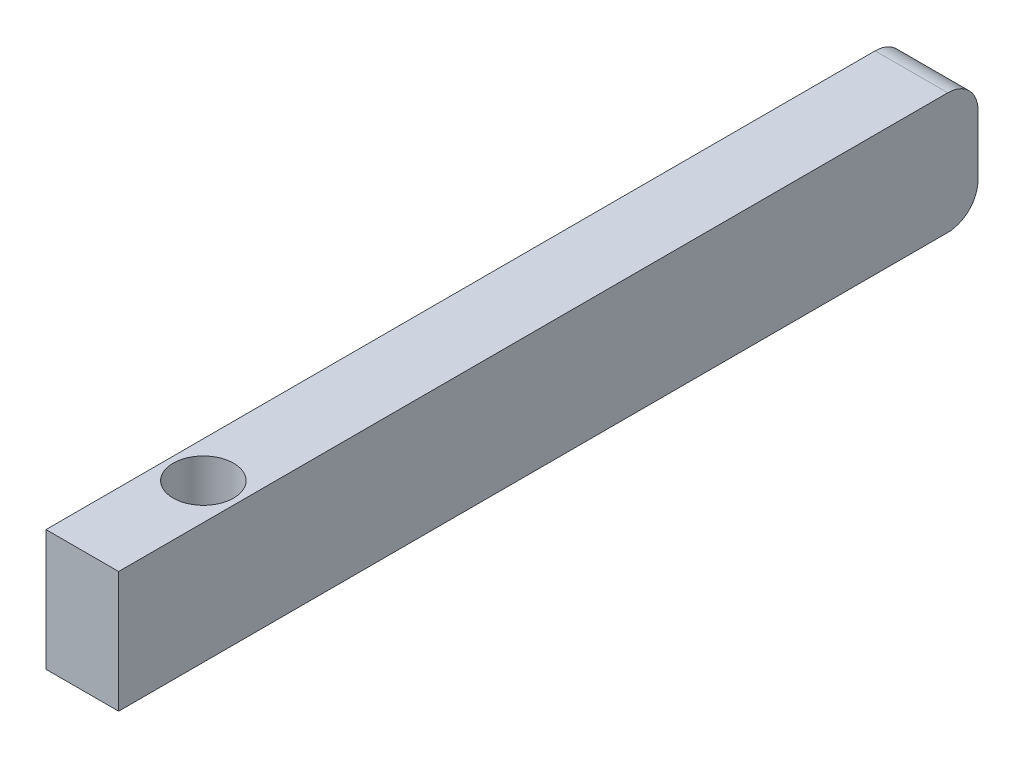
ISO-10303-21;
HEADER;
FILE_DESCRIPTION(('STEP AP214'),'2;1');
FILE_NAME('part.step','',(''),(''),'','','');
FILE_SCHEMA(('AUTOMOTIVE_DESIGN { 1 0 10303 214 1 1 1 1 }'));
ENDSEC;
DATA;
#1=APPLICATION_CONTEXT('core data for automotive mechanical design processes');
#2=APPLICATION_PROTOCOL_DEFINITION('international standard','automotive_design',2000,#1);
#3=PRODUCT_CONTEXT('',#1,'mechanical');
#4=PRODUCT('Part','Part','',(#3));
#5=PRODUCT_RELATED_PRODUCT_CATEGORY('part','',(#4));
#6=PRODUCT_DEFINITION_FORMATION('','',#4);
#7=PRODUCT_DEFINITION_CONTEXT('part definition',#1,'design');
#8=PRODUCT_DEFINITION('design','',#6,#7);
#9=PRODUCT_DEFINITION_SHAPE('','',#8);
#10=(LENGTH_UNIT() NAMED_UNIT(*) SI_UNIT(.MILLI.,.METRE.));
#11=(NAMED_UNIT(*) PLANE_ANGLE_UNIT() SI_UNIT($,.RADIAN.));
#12=(NAMED_UNIT(*) SI_UNIT($,.STERADIAN.) SOLID_ANGLE_UNIT());
#13=UNCERTAINTY_MEASURE_WITH_UNIT(LENGTH_MEASURE(1.E-05),#10,'distance_accuracy_value','');
#14=(GEOMETRIC_REPRESENTATION_CONTEXT(3) GLOBAL_UNCERTAINTY_ASSIGNED_CONTEXT((#13)) GLOBAL_UNIT_ASSIGNED_CONTEXT((#10,
#11,#12)) REPRESENTATION_CONTEXT('',''));
#15=CARTESIAN_POINT('',(0.,0.,0.));
#16=DIRECTION('',(0.,0.,1.));
#17=DIRECTION('',(1.,0.,0.));
#18=AXIS2_PLACEMENT_3D('',#15,#16,#17);
#19=CARTESIAN_POINT('',(-0.6,2.,0.));
#20=DIRECTION('',(-1.,0.,0.));
#21=DIRECTION('',(0.,0.,1.));
#22=AXIS2_PLACEMENT_3D('',#19,#20,#21);
#23=PLANE('',#22);
#24=DIRECTION('',(0.,0.,-1.));
#25=VECTOR('',#24,1.);
#26=CARTESIAN_POINT('',(-0.6,2.,0.));
#27=LINE('',#26,#25);
#28=CARTESIAN_POINT('',(-0.6,2.,2.));
#29=VERTEX_POINT('',#28);
#30=CARTESIAN_POINT('',(-0.6,2.,-11.7));
#31=VERTEX_POINT('',#30);
#32=EDGE_CURVE('E93',#29,#31,#27,.T.);
#33=ORIENTED_EDGE('',*,*,#32,.T.);
#34=CARTESIAN_POINT('',(-0.6,1.5,-11.7));
#35=DIRECTION('',(-1.,0.,0.));
#36=DIRECTION('',(0.,0.,1.));
#37=AXIS2_PLACEMENT_3D('',#34,#35,#36);
#38=CIRCLE('',#37,0.5);
#39=CARTESIAN_POINT('',(-0.6,1.5,-12.2));
#40=VERTEX_POINT('',#39);
#41=EDGE_CURVE('E45',#31,#40,#38,.T.);
#42=ORIENTED_EDGE('',*,*,#41,.T.);
#43=DIRECTION('',(0.,-1.,0.));
#44=VECTOR('',#43,1.);
#45=CARTESIAN_POINT('',(-0.6,2.,-12.2));
#46=LINE('',#45,#44);
#47=CARTESIAN_POINT('',(-0.6,0.5,-12.2));
#48=VERTEX_POINT('',#47);
#49=EDGE_CURVE('E120',#40,#48,#46,.T.);
#50=ORIENTED_EDGE('',*,*,#49,.T.);
#51=CARTESIAN_POINT('',(-0.6,0.5,-11.7));
#52=DIRECTION('',(-1.,0.,0.));
#53=DIRECTION('',(0.,0.,1.));
#54=AXIS2_PLACEMENT_3D('',#51,#52,#53);
#55=CIRCLE('',#54,0.5);
#56=CARTESIAN_POINT('',(-0.6,0.,-11.7));
#57=VERTEX_POINT('',#56);
#58=EDGE_CURVE('E52',#48,#57,#55,.T.);
#59=ORIENTED_EDGE('',*,*,#58,.T.);
#60=DIRECTION('',(0.,0.,-1.));
#61=VECTOR('',#60,1.);
#62=CARTESIAN_POINT('',(-0.6,0.,0.));
#63=LINE('',#62,#61);
#64=CARTESIAN_POINT('',(-0.6,0.,2.));
#65=VERTEX_POINT('',#64);
#66=EDGE_CURVE('E95',#65,#57,#63,.T.);
#67=ORIENTED_EDGE('',*,*,#66,.F.);
#68=DIRECTION('',(0.,-1.,0.));
#69=VECTOR('',#68,1.);
#70=CARTESIAN_POINT('',(-0.6,2.,2.));
#71=LINE('',#70,#69);
#72=EDGE_CURVE('E91',#29,#65,#71,.T.);
#73=ORIENTED_EDGE('',*,*,#72,.F.);
#74=EDGE_LOOP('',(#33,#42,#50,#59,#67,#73));
#75=FACE_BOUND('',#74,.T.);
#76=ADVANCED_FACE('F37',(#75),#23,.T.);
#77=CARTESIAN_POINT('',(0.,2.,2.));
#78=DIRECTION('',(0.,0.,-1.));
#79=DIRECTION('',(-1.,0.,0.));
#80=AXIS2_PLACEMENT_3D('',#77,#78,#79);
#81=PLANE('',#80);
#82=DIRECTION('',(1.,0.,0.));
#83=VECTOR('',#82,1.);
#84=CARTESIAN_POINT('',(0.,0.,2.));
#85=LINE('',#84,#83);
#86=CARTESIAN_POINT('',(0.6,0.,2.));
#87=VERTEX_POINT('',#86);
#88=EDGE_CURVE('E122',#65,#87,#85,.T.);
#89=ORIENTED_EDGE('',*,*,#88,.T.);
#90=DIRECTION('',(0.,-1.,0.));
#91=VECTOR('',#90,1.);
#92=CARTESIAN_POINT('',(0.6,2.,2.));
#93=LINE('',#92,#91);
#94=CARTESIAN_POINT('',(0.6,2.,2.));
#95=VERTEX_POINT('',#94);
#96=EDGE_CURVE('E99',#95,#87,#93,.T.);
#97=ORIENTED_EDGE('',*,*,#96,.F.);
#98=DIRECTION('',(1.,0.,0.));
#99=VECTOR('',#98,1.);
#100=CARTESIAN_POINT('',(0.,2.,2.));
#101=LINE('',#100,#99);
#102=EDGE_CURVE('E102',#29,#95,#101,.T.);
#103=ORIENTED_EDGE('',*,*,#102,.F.);
#104=ORIENTED_EDGE('',*,*,#72,.T.);
#105=EDGE_LOOP('',(#89,#97,#103,#104));
#106=FACE_BOUND('',#105,.T.);
#107=ADVANCED_FACE('F103',(#106),#81,.F.);
#108=CARTESIAN_POINT('',(0.6,2.,0.));
#109=DIRECTION('',(-1.,0.,0.));
#110=DIRECTION('',(0.,0.,1.));
#111=AXIS2_PLACEMENT_3D('',#108,#109,#110);
#112=PLANE('',#111);
#113=DIRECTION('',(0.,-1.,0.));
#114=VECTOR('',#113,1.);
#115=CARTESIAN_POINT('',(0.6,2.,-12.2));
#116=LINE('',#115,#114);
#117=CARTESIAN_POINT('',(0.6,1.5,-12.2));
#118=VERTEX_POINT('',#117);
#119=CARTESIAN_POINT('',(0.6,0.5,-12.2));
#120=VERTEX_POINT('',#119);
#121=EDGE_CURVE('E127',#118,#120,#116,.T.);
#122=ORIENTED_EDGE('',*,*,#121,.F.);
#123=CARTESIAN_POINT('',(0.6,1.5,-11.7));
#124=DIRECTION('',(-1.,0.,0.));
#125=DIRECTION('',(0.,0.,1.));
#126=AXIS2_PLACEMENT_3D('',#123,#124,#125);
#127=CIRCLE('',#126,0.5);
#128=CARTESIAN_POINT('',(0.6,2.,-11.7));
#129=VERTEX_POINT('',#128);
#130=EDGE_CURVE('E137',#118,#129,#127,.F.);
#131=ORIENTED_EDGE('',*,*,#130,.T.);
#132=DIRECTION('',(0.,0.,-1.));
#133=VECTOR('',#132,1.);
#134=CARTESIAN_POINT('',(0.6,2.,0.));
#135=LINE('',#134,#133);
#136=EDGE_CURVE('E106',#95,#129,#135,.T.);
#137=ORIENTED_EDGE('',*,*,#136,.F.);
#138=ORIENTED_EDGE('',*,*,#96,.T.);
#139=DIRECTION('',(0.,0.,-1.));
#140=VECTOR('',#139,1.);
#141=CARTESIAN_POINT('',(0.6,0.,0.));
#142=LINE('',#141,#140);
#143=CARTESIAN_POINT('',(0.6,0.,-11.7));
#144=VERTEX_POINT('',#143);
#145=EDGE_CURVE('E113',#87,#144,#142,.T.);
#146=ORIENTED_EDGE('',*,*,#145,.T.);
#147=CARTESIAN_POINT('',(0.6,0.5,-11.7));
#148=DIRECTION('',(-1.,0.,0.));
#149=DIRECTION('',(0.,0.,1.));
#150=AXIS2_PLACEMENT_3D('',#147,#148,#149);
#151=CIRCLE('',#150,0.5);
#152=EDGE_CURVE('E135',#144,#120,#151,.F.);
#153=ORIENTED_EDGE('',*,*,#152,.T.);
#154=EDGE_LOOP('',(#122,#131,#137,#138,#146,#153));
#155=FACE_BOUND('',#154,.T.);
#156=ADVANCED_FACE('F149',(#155),#112,.F.);
#157=CARTESIAN_POINT('',(0.,2.,-12.2));
#158=DIRECTION('',(0.,0.,-1.));
#159=DIRECTION('',(-1.,0.,0.));
#160=AXIS2_PLACEMENT_3D('',#157,#158,#159);
#161=PLANE('',#160);
#162=ORIENTED_EDGE('',*,*,#49,.F.);
#163=DIRECTION('',(1.,0.,0.));
#164=VECTOR('',#163,1.);
#165=CARTESIAN_POINT('',(0.,1.5,-12.2));
#166=LINE('',#165,#164);
#167=EDGE_CURVE('E132',#40,#118,#166,.T.);
#168=ORIENTED_EDGE('',*,*,#167,.T.);
#169=ORIENTED_EDGE('',*,*,#121,.T.);
#170=DIRECTION('',(1.,0.,0.));
#171=VECTOR('',#170,1.);
#172=CARTESIAN_POINT('',(-0.6,0.5,-12.2));
#173=LINE('',#172,#171);
#174=EDGE_CURVE('E98',#120,#48,#173,.F.);
#175=ORIENTED_EDGE('',*,*,#174,.T.);
#176=EDGE_LOOP('',(#162,#168,#169,#175));
#177=FACE_BOUND('',#176,.T.);
#178=ADVANCED_FACE('F144',(#177),#161,.T.);
#179=CARTESIAN_POINT('',(0.,2.,0.));
#180=DIRECTION('',(0.,-1.,0.));
#181=DIRECTION('',(0.,0.,-1.));
#182=AXIS2_PLACEMENT_3D('',#179,#180,#181);
#183=CYLINDRICAL_SURFACE('',#182,0.5);
#184=CARTESIAN_POINT('',(0.,2.,0.));
#185=DIRECTION('',(0.,1.,0.));
#186=DIRECTION('',(0.,0.,1.));
#187=AXIS2_PLACEMENT_3D('',#184,#185,#186);
#188=CIRCLE('',#187,0.5);
#189=CARTESIAN_POINT('',(0.,2.,0.5));
#190=VERTEX_POINT('',#189);
#191=EDGE_CURVE('E117',#190,#190,#188,.T.);
#192=ORIENTED_EDGE('',*,*,#191,.T.);
#193=EDGE_LOOP('',(#192));
#194=FACE_BOUND('',#193,.T.);
#195=CARTESIAN_POINT('',(0.,0.,0.));
#196=DIRECTION('',(0.,1.,0.));
#197=DIRECTION('',(0.,0.,1.));
#198=AXIS2_PLACEMENT_3D('',#195,#196,#197);
#199=CIRCLE('',#198,0.5);
#200=CARTESIAN_POINT('',(0.,0.,0.5));
#201=VERTEX_POINT('',#200);
#202=EDGE_CURVE('E110',#201,#201,#199,.T.);
#203=ORIENTED_EDGE('',*,*,#202,.F.);
#204=EDGE_LOOP('',(#203));
#205=FACE_BOUND('',#204,.T.);
#206=ADVANCED_FACE('F160',(#194,#205),#183,.F.);
#207=CARTESIAN_POINT('',(0.,2.,0.));
#208=DIRECTION('',(0.,1.,0.));
#209=DIRECTION('',(0.,0.,1.));
#210=AXIS2_PLACEMENT_3D('',#207,#208,#209);
#211=PLANE('',#210);
#212=ORIENTED_EDGE('',*,*,#136,.T.);
#213=DIRECTION('',(1.,0.,0.));
#214=VECTOR('',#213,1.);
#215=CARTESIAN_POINT('',(0.,2.,-11.7));
#216=LINE('',#215,#214);
#217=EDGE_CURVE('E60',#129,#31,#216,.F.);
#218=ORIENTED_EDGE('',*,*,#217,.T.);
#219=ORIENTED_EDGE('',*,*,#32,.F.);
#220=ORIENTED_EDGE('',*,*,#102,.T.);
#221=EDGE_LOOP('',(#212,#218,#219,#220));
#222=FACE_BOUND('',#221,.T.);
#223=ORIENTED_EDGE('',*,*,#191,.F.);
#224=EDGE_LOOP('',(#223));
#225=FACE_BOUND('',#224,.T.);
#226=ADVANCED_FACE('F108',(#222,#225),#211,.T.);
#227=CARTESIAN_POINT('',(0.,0.,0.));
#228=DIRECTION('',(0.,1.,0.));
#229=DIRECTION('',(0.,0.,1.));
#230=AXIS2_PLACEMENT_3D('',#227,#228,#229);
#231=PLANE('',#230);
#232=ORIENTED_EDGE('',*,*,#66,.T.);
#233=DIRECTION('',(1.,0.,0.));
#234=VECTOR('',#233,1.);
#235=CARTESIAN_POINT('',(0.6,0.,-11.7));
#236=LINE('',#235,#234);
#237=EDGE_CURVE('E11',#57,#144,#236,.T.);
#238=ORIENTED_EDGE('',*,*,#237,.T.);
#239=ORIENTED_EDGE('',*,*,#145,.F.);
#240=ORIENTED_EDGE('',*,*,#88,.F.);
#241=EDGE_LOOP('',(#232,#238,#239,#240));
#242=FACE_BOUND('',#241,.T.);
#243=ORIENTED_EDGE('',*,*,#202,.T.);
#244=EDGE_LOOP('',(#243));
#245=FACE_BOUND('',#244,.T.);
#246=ADVANCED_FACE('F154',(#242,#245),#231,.F.);
#247=CARTESIAN_POINT('',(0.,1.5,-11.7));
#248=DIRECTION('',(1.,0.,0.));
#249=DIRECTION('',(0.,0.,-1.));
#250=AXIS2_PLACEMENT_3D('',#247,#248,#249);
#251=CYLINDRICAL_SURFACE('',#250,0.5);
#252=ORIENTED_EDGE('',*,*,#41,.F.);
#253=ORIENTED_EDGE('',*,*,#217,.F.);
#254=ORIENTED_EDGE('',*,*,#130,.F.);
#255=ORIENTED_EDGE('',*,*,#167,.F.);
#256=EDGE_LOOP('',(#252,#253,#254,#255));
#257=FACE_BOUND('',#256,.T.);
#258=ADVANCED_FACE('F147',(#257),#251,.T.);
#259=CARTESIAN_POINT('',(0.,0.5,-11.7));
#260=DIRECTION('',(-1.,0.,0.));
#261=DIRECTION('',(0.,0.,1.));
#262=AXIS2_PLACEMENT_3D('',#259,#260,#261);
#263=CYLINDRICAL_SURFACE('',#262,0.5);
#264=ORIENTED_EDGE('',*,*,#58,.F.);
#265=ORIENTED_EDGE('',*,*,#174,.F.);
#266=ORIENTED_EDGE('',*,*,#152,.F.);
#267=ORIENTED_EDGE('',*,*,#237,.F.);
#268=EDGE_LOOP('',(#264,#265,#266,#267));
#269=FACE_BOUND('',#268,.T.);
#270=ADVANCED_FACE('F39',(#269),#263,.T.);
#271=CLOSED_SHELL('',(#76,#107,#156,#178,#206,#226,#246,#258,#270));
#272=MANIFOLD_SOLID_BREP('B2',#271);
#273=ADVANCED_BREP_SHAPE_REPRESENTATION('',(#18,#272),#14);
#274=SHAPE_DEFINITION_REPRESENTATION(#9,#273);
ENDSEC;
END-ISO-10303-21;
